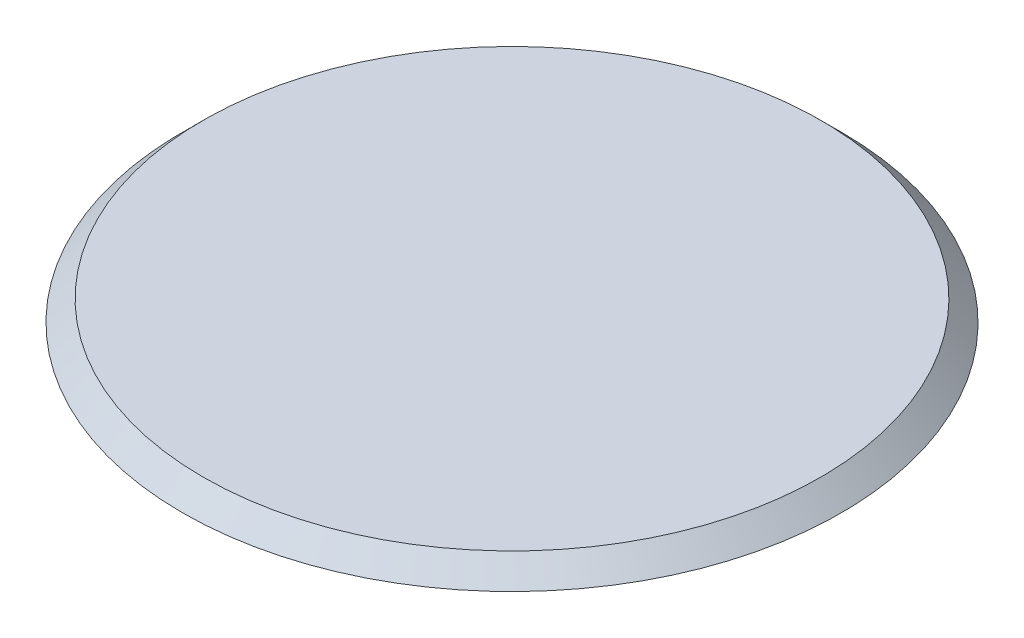
ISO-10303-21;
HEADER;
FILE_DESCRIPTION(('STEP AP214'),'2;1');
FILE_NAME('part.step','',(''),(''),'','','');
FILE_SCHEMA(('AUTOMOTIVE_DESIGN { 1 0 10303 214 1 1 1 1 }'));
ENDSEC;
DATA;
#1=APPLICATION_CONTEXT('core data for automotive mechanical design processes');
#2=APPLICATION_PROTOCOL_DEFINITION('international standard','automotive_design',2000,#1);
#3=PRODUCT_CONTEXT('',#1,'mechanical');
#4=PRODUCT('Part','Part','',(#3));
#5=PRODUCT_RELATED_PRODUCT_CATEGORY('part','',(#4));
#6=PRODUCT_DEFINITION_FORMATION('','',#4);
#7=PRODUCT_DEFINITION_CONTEXT('part definition',#1,'design');
#8=PRODUCT_DEFINITION('design','',#6,#7);
#9=PRODUCT_DEFINITION_SHAPE('','',#8);
#10=(LENGTH_UNIT() NAMED_UNIT(*) SI_UNIT(.MILLI.,.METRE.));
#11=(NAMED_UNIT(*) PLANE_ANGLE_UNIT() SI_UNIT($,.RADIAN.));
#12=(NAMED_UNIT(*) SI_UNIT($,.STERADIAN.) SOLID_ANGLE_UNIT());
#13=UNCERTAINTY_MEASURE_WITH_UNIT(LENGTH_MEASURE(1.E-05),#10,'distance_accuracy_value','');
#14=(GEOMETRIC_REPRESENTATION_CONTEXT(3) GLOBAL_UNCERTAINTY_ASSIGNED_CONTEXT((#13)) GLOBAL_UNIT_ASSIGNED_CONTEXT((#10,
#11,#12)) REPRESENTATION_CONTEXT('',''));
#15=CARTESIAN_POINT('',(0.,0.,0.));
#16=DIRECTION('',(0.,0.,1.));
#17=DIRECTION('',(1.,0.,0.));
#18=AXIS2_PLACEMENT_3D('',#15,#16,#17);
#19=CARTESIAN_POINT('',(0.,0.,0.));
#20=DIRECTION('',(0.,1.,0.));
#21=DIRECTION('',(0.,0.,1.));
#22=AXIS2_PLACEMENT_3D('',#19,#20,#21);
#23=PLANE('',#22);
#24=CARTESIAN_POINT('',(0.,0.,0.));
#25=DIRECTION('',(0.,1.,0.));
#26=DIRECTION('',(0.,0.,1.));
#27=AXIS2_PLACEMENT_3D('',#24,#25,#26);
#28=CIRCLE('',#27,15.2928932188134);
#29=CARTESIAN_POINT('',(0.,0.,15.2928932188134));
#30=VERTEX_POINT('',#29);
#31=EDGE_CURVE('E45',#30,#30,#28,.T.);
#32=ORIENTED_EDGE('',*,*,#31,.T.);
#33=EDGE_LOOP('',(#32));
#34=FACE_BOUND('',#33,.T.);
#35=CARTESIAN_POINT('',(0.,0.,0.));
#36=DIRECTION('',(0.,1.,0.));
#37=DIRECTION('',(0.,0.,1.));
#38=AXIS2_PLACEMENT_3D('',#35,#36,#37);
#39=CIRCLE('',#38,16.);
#40=CARTESIAN_POINT('',(0.,0.,16.));
#41=VERTEX_POINT('',#40);
#42=EDGE_CURVE('E37',#41,#41,#39,.T.);
#43=ORIENTED_EDGE('',*,*,#42,.F.);
#44=EDGE_LOOP('',(#43));
#45=FACE_BOUND('',#44,.T.);
#46=ADVANCED_FACE('F30',(#34,#45),#23,.F.);
#47=CARTESIAN_POINT('',(0.,0.,0.));
#48=DIRECTION('',(0.,-1.,0.));
#49=DIRECTION('',(0.,0.,-1.));
#50=AXIS2_PLACEMENT_3D('',#47,#48,#49);
#51=CONICAL_SURFACE('',#50,16.,0.785398163397454);
#52=CARTESIAN_POINT('',(0.,1.,0.));
#53=DIRECTION('',(0.,1.,0.));
#54=DIRECTION('',(0.,0.,1.));
#55=AXIS2_PLACEMENT_3D('',#52,#53,#54);
#56=CIRCLE('',#55,15.);
#57=CARTESIAN_POINT('',(0.,1.,15.));
#58=VERTEX_POINT('',#57);
#59=EDGE_CURVE('E41',#58,#58,#56,.T.);
#60=ORIENTED_EDGE('',*,*,#59,.F.);
#61=EDGE_LOOP('',(#60));
#62=FACE_BOUND('',#61,.T.);
#63=ORIENTED_EDGE('',*,*,#42,.T.);
#64=EDGE_LOOP('',(#63));
#65=FACE_BOUND('',#64,.T.);
#66=ADVANCED_FACE('F62',(#62,#65),#51,.T.);
#67=CARTESIAN_POINT('',(15.,1.,0.));
#68=DIRECTION('',(0.,-1.,0.));
#69=DIRECTION('',(0.,0.,-1.));
#70=AXIS2_PLACEMENT_3D('',#67,#68,#69);
#71=PLANE('',#70);
#72=ORIENTED_EDGE('',*,*,#59,.T.);
#73=EDGE_LOOP('',(#72));
#74=FACE_BOUND('',#73,.T.);
#75=ADVANCED_FACE('F59',(#74),#71,.F.);
#76=CARTESIAN_POINT('',(15.,0.5,0.));
#77=DIRECTION('',(0.,-1.,0.));
#78=DIRECTION('',(0.,0.,-1.));
#79=AXIS2_PLACEMENT_3D('',#76,#77,#78);
#80=PLANE('',#79);
#81=CARTESIAN_POINT('',(0.,0.5,0.));
#82=DIRECTION('',(0.,-1.,0.));
#83=DIRECTION('',(0.,0.,-1.));
#84=AXIS2_PLACEMENT_3D('',#81,#82,#83);
#85=CIRCLE('',#84,11.3242662522166);
#86=CARTESIAN_POINT('',(0.,0.5,-11.3242662522166));
#87=VERTEX_POINT('',#86);
#88=EDGE_CURVE('E10',#87,#87,#85,.T.);
#89=ORIENTED_EDGE('',*,*,#88,.T.);
#90=EDGE_LOOP('',(#89));
#91=FACE_BOUND('',#90,.T.);
#92=ADVANCED_FACE('F54',(#91),#80,.T.);
#93=CARTESIAN_POINT('',(0.,-15.5,0.));
#94=DIRECTION('',(0.,1.,0.));
#95=DIRECTION('',(0.,0.,1.));
#96=AXIS2_PLACEMENT_3D('',#93,#94,#95);
#97=DEGENERATE_TOROIDAL_SURFACE('',#96,11.3242662522166,16.,.T.);
#98=ORIENTED_EDGE('',*,*,#88,.F.);
#99=EDGE_LOOP('',(#98));
#100=FACE_BOUND('',#99,.T.);
#101=ORIENTED_EDGE('',*,*,#31,.F.);
#102=EDGE_LOOP('',(#101));
#103=FACE_BOUND('',#102,.T.);
#104=ADVANCED_FACE('F32',(#100,#103),#97,.F.);
#105=CLOSED_SHELL('',(#46,#66,#75,#92,#104));
#106=MANIFOLD_SOLID_BREP('B2',#105);
#107=ADVANCED_BREP_SHAPE_REPRESENTATION('',(#18,#106),#14);
#108=SHAPE_DEFINITION_REPRESENTATION(#9,#107);
ENDSEC;
END-ISO-10303-21;
